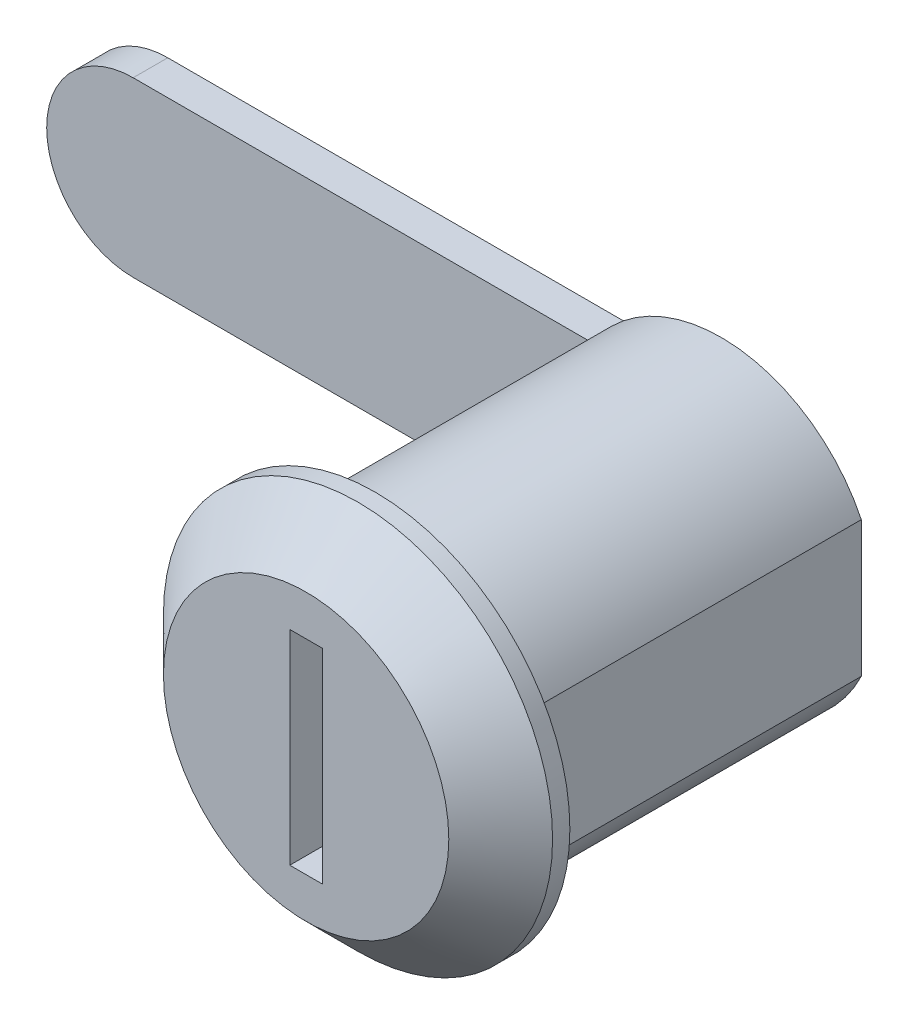
ISO-10303-21;
HEADER;
FILE_DESCRIPTION(('STEP AP214'),'2;1');
FILE_NAME('part.step','',(''),(''),'','','');
FILE_SCHEMA(('AUTOMOTIVE_DESIGN { 1 0 10303 214 1 1 1 1 }'));
ENDSEC;
DATA;
#1=APPLICATION_CONTEXT('core data for automotive mechanical design processes');
#2=APPLICATION_PROTOCOL_DEFINITION('international standard','automotive_design',2000,#1);
#3=PRODUCT_CONTEXT('',#1,'mechanical');
#4=PRODUCT('Part','Part','',(#3));
#5=PRODUCT_RELATED_PRODUCT_CATEGORY('part','',(#4));
#6=PRODUCT_DEFINITION_FORMATION('','',#4);
#7=PRODUCT_DEFINITION_CONTEXT('part definition',#1,'design');
#8=PRODUCT_DEFINITION('design','',#6,#7);
#9=PRODUCT_DEFINITION_SHAPE('','',#8);
#10=(LENGTH_UNIT() NAMED_UNIT(*) SI_UNIT(.MILLI.,.METRE.));
#11=(NAMED_UNIT(*) PLANE_ANGLE_UNIT() SI_UNIT($,.RADIAN.));
#12=(NAMED_UNIT(*) SI_UNIT($,.STERADIAN.) SOLID_ANGLE_UNIT());
#13=UNCERTAINTY_MEASURE_WITH_UNIT(LENGTH_MEASURE(1.E-05),#10,'distance_accuracy_value','');
#14=(GEOMETRIC_REPRESENTATION_CONTEXT(3) GLOBAL_UNCERTAINTY_ASSIGNED_CONTEXT((#13)) GLOBAL_UNIT_ASSIGNED_CONTEXT((#10,
#11,#12)) REPRESENTATION_CONTEXT('',''));
#15=CARTESIAN_POINT('',(0.,0.,0.));
#16=DIRECTION('',(0.,0.,1.));
#17=DIRECTION('',(1.,0.,0.));
#18=AXIS2_PLACEMENT_3D('',#15,#16,#17);
#19=CARTESIAN_POINT('',(0.,0.,0.));
#20=DIRECTION('',(0.,0.,1.));
#21=DIRECTION('',(1.,0.,0.));
#22=AXIS2_PLACEMENT_3D('',#19,#20,#21);
#23=PLANE('',#22);
#24=CARTESIAN_POINT('',(0.,0.,0.));
#25=DIRECTION('',(0.,0.,1.));
#26=DIRECTION('',(1.,0.,0.));
#27=AXIS2_PLACEMENT_3D('',#24,#25,#26);
#28=CIRCLE('',#27,11.25);
#29=CARTESIAN_POINT('',(11.25,0.,0.));
#30=VERTEX_POINT('',#29);
#31=EDGE_CURVE('E223',#30,#30,#28,.T.);
#32=ORIENTED_EDGE('',*,*,#31,.F.);
#33=EDGE_LOOP('',(#32));
#34=FACE_BOUND('',#33,.T.);
#35=CARTESIAN_POINT('',(0.,0.,0.));
#36=DIRECTION('',(0.,0.,-1.));
#37=DIRECTION('',(-1.,0.,0.));
#38=AXIS2_PLACEMENT_3D('',#35,#36,#37);
#39=CIRCLE('',#38,9.);
#40=CARTESIAN_POINT('',(8.1,-3.92300904918661,0.));
#41=VERTEX_POINT('',#40);
#42=CARTESIAN_POINT('',(-8.1,-3.92300904918661,0.));
#43=VERTEX_POINT('',#42);
#44=EDGE_CURVE('E156',#41,#43,#39,.T.);
#45=ORIENTED_EDGE('',*,*,#44,.F.);
#46=DIRECTION('',(0.,-1.,0.));
#47=VECTOR('',#46,1.);
#48=CARTESIAN_POINT('',(8.1,-3.92300904918661,0.));
#49=LINE('',#48,#47);
#50=CARTESIAN_POINT('',(8.1,3.92300904918661,0.));
#51=VERTEX_POINT('',#50);
#52=EDGE_CURVE('E183',#51,#41,#49,.T.);
#53=ORIENTED_EDGE('',*,*,#52,.F.);
#54=CARTESIAN_POINT('',(0.,0.,0.));
#55=DIRECTION('',(0.,0.,-1.));
#56=DIRECTION('',(-1.,0.,0.));
#57=AXIS2_PLACEMENT_3D('',#54,#55,#56);
#58=CIRCLE('',#57,9.);
#59=CARTESIAN_POINT('',(-8.1,3.92300904918661,0.));
#60=VERTEX_POINT('',#59);
#61=EDGE_CURVE('E180',#60,#51,#58,.T.);
#62=ORIENTED_EDGE('',*,*,#61,.F.);
#63=DIRECTION('',(0.,1.,0.));
#64=VECTOR('',#63,1.);
#65=CARTESIAN_POINT('',(-8.1,-3.92300904918661,0.));
#66=LINE('',#65,#64);
#67=EDGE_CURVE('E159',#43,#60,#66,.T.);
#68=ORIENTED_EDGE('',*,*,#67,.F.);
#69=EDGE_LOOP('',(#45,#53,#62,#68));
#70=FACE_BOUND('',#69,.T.);
#71=ADVANCED_FACE('F40',(#34,#70),#23,.F.);
#72=CARTESIAN_POINT('',(0.,0.,4.));
#73=DIRECTION('',(0.,0.,-1.));
#74=DIRECTION('',(-1.,0.,0.));
#75=AXIS2_PLACEMENT_3D('',#72,#73,#74);
#76=CYLINDRICAL_SURFACE('',#75,11.25);
#77=CARTESIAN_POINT('',(0.,0.,0.999999999999982));
#78=DIRECTION('',(0.,0.,1.));
#79=DIRECTION('',(1.,0.,0.));
#80=AXIS2_PLACEMENT_3D('',#77,#78,#79);
#81=CIRCLE('',#80,11.25);
#82=CARTESIAN_POINT('',(11.25,0.,0.999999999999982));
#83=VERTEX_POINT('',#82);
#84=EDGE_CURVE('E11',#83,#83,#81,.F.);
#85=ORIENTED_EDGE('',*,*,#84,.T.);
#86=EDGE_LOOP('',(#85));
#87=FACE_BOUND('',#86,.T.);
#88=ORIENTED_EDGE('',*,*,#31,.T.);
#89=EDGE_LOOP('',(#88));
#90=FACE_BOUND('',#89,.T.);
#91=ADVANCED_FACE('F264',(#87,#90),#76,.T.);
#92=CARTESIAN_POINT('',(0.,0.,4.));
#93=DIRECTION('',(0.,0.,1.));
#94=DIRECTION('',(1.,0.,0.));
#95=AXIS2_PLACEMENT_3D('',#92,#93,#94);
#96=PLANE('',#95);
#97=CARTESIAN_POINT('',(0.,0.,4.));
#98=DIRECTION('',(0.,0.,1.));
#99=DIRECTION('',(1.,0.,0.));
#100=AXIS2_PLACEMENT_3D('',#97,#98,#99);
#101=CIRCLE('',#100,8.24999999999999);
#102=CARTESIAN_POINT('',(8.24999999999999,0.,4.));
#103=VERTEX_POINT('',#102);
#104=EDGE_CURVE('E49',#103,#103,#101,.T.);
#105=ORIENTED_EDGE('',*,*,#104,.T.);
#106=EDGE_LOOP('',(#105));
#107=FACE_BOUND('',#106,.T.);
#108=DIRECTION('',(0.,1.,0.));
#109=VECTOR('',#108,1.);
#110=CARTESIAN_POINT('',(0.945004589681275,-5.90323373364755,4.));
#111=LINE('',#110,#109);
#112=CARTESIAN_POINT('',(0.945004589681275,-5.90323373364755,4.));
#113=VERTEX_POINT('',#112);
#114=CARTESIAN_POINT('',(0.945004589681275,5.90323373364754,4.));
#115=VERTEX_POINT('',#114);
#116=EDGE_CURVE('E197',#113,#115,#111,.T.);
#117=ORIENTED_EDGE('',*,*,#116,.F.);
#118=DIRECTION('',(1.,0.,0.));
#119=VECTOR('',#118,1.);
#120=CARTESIAN_POINT('',(-0.945004589681277,-5.90323373364755,4.));
#121=LINE('',#120,#119);
#122=CARTESIAN_POINT('',(-0.945004589681277,-5.90323373364755,4.));
#123=VERTEX_POINT('',#122);
#124=EDGE_CURVE('E202',#123,#113,#121,.T.);
#125=ORIENTED_EDGE('',*,*,#124,.F.);
#126=DIRECTION('',(0.,-1.,0.));
#127=VECTOR('',#126,1.);
#128=CARTESIAN_POINT('',(-0.945004589681277,-5.90323373364755,4.));
#129=LINE('',#128,#127);
#130=CARTESIAN_POINT('',(-0.945004589681277,5.90323373364754,4.));
#131=VERTEX_POINT('',#130);
#132=EDGE_CURVE('E216',#131,#123,#129,.T.);
#133=ORIENTED_EDGE('',*,*,#132,.F.);
#134=DIRECTION('',(-1.,0.,0.));
#135=VECTOR('',#134,1.);
#136=CARTESIAN_POINT('',(-0.945004589681277,5.90323373364754,4.));
#137=LINE('',#136,#135);
#138=EDGE_CURVE('E213',#115,#131,#137,.T.);
#139=ORIENTED_EDGE('',*,*,#138,.F.);
#140=EDGE_LOOP('',(#117,#125,#133,#139));
#141=FACE_BOUND('',#140,.T.);
#142=ADVANCED_FACE('F270',(#107,#141),#96,.T.);
#143=CARTESIAN_POINT('',(0.945004589681275,-5.90323373364755,2.));
#144=DIRECTION('',(1.,0.,0.));
#145=DIRECTION('',(0.,0.,-1.));
#146=AXIS2_PLACEMENT_3D('',#143,#144,#145);
#147=PLANE('',#146);
#148=ORIENTED_EDGE('',*,*,#116,.T.);
#149=DIRECTION('',(0.,0.,1.));
#150=VECTOR('',#149,1.);
#151=CARTESIAN_POINT('',(0.945004589681275,5.90323373364754,2.));
#152=LINE('',#151,#150);
#153=CARTESIAN_POINT('',(0.945004589681275,5.90323373364754,2.));
#154=VERTEX_POINT('',#153);
#155=EDGE_CURVE('E211',#154,#115,#152,.T.);
#156=ORIENTED_EDGE('',*,*,#155,.F.);
#157=DIRECTION('',(0.,1.,0.));
#158=VECTOR('',#157,1.);
#159=CARTESIAN_POINT('',(0.945004589681275,-5.90323373364755,2.));
#160=LINE('',#159,#158);
#161=CARTESIAN_POINT('',(0.945004589681275,-5.90323373364755,2.));
#162=VERTEX_POINT('',#161);
#163=EDGE_CURVE('E198',#162,#154,#160,.T.);
#164=ORIENTED_EDGE('',*,*,#163,.F.);
#165=DIRECTION('',(0.,0.,1.));
#166=VECTOR('',#165,1.);
#167=CARTESIAN_POINT('',(0.945004589681275,-5.90323373364755,2.));
#168=LINE('',#167,#166);
#169=EDGE_CURVE('E221',#162,#113,#168,.T.);
#170=ORIENTED_EDGE('',*,*,#169,.T.);
#171=EDGE_LOOP('',(#148,#156,#164,#170));
#172=FACE_BOUND('',#171,.T.);
#173=ADVANCED_FACE('F277',(#172),#147,.F.);
#174=CARTESIAN_POINT('',(-0.945004589681277,-5.90323373364755,2.));
#175=DIRECTION('',(0.,-1.,0.));
#176=DIRECTION('',(0.,0.,-1.));
#177=AXIS2_PLACEMENT_3D('',#174,#175,#176);
#178=PLANE('',#177);
#179=ORIENTED_EDGE('',*,*,#124,.T.);
#180=ORIENTED_EDGE('',*,*,#169,.F.);
#181=DIRECTION('',(1.,0.,0.));
#182=VECTOR('',#181,1.);
#183=CARTESIAN_POINT('',(-0.945004589681277,-5.90323373364755,2.));
#184=LINE('',#183,#182);
#185=CARTESIAN_POINT('',(-0.945004589681277,-5.90323373364755,2.));
#186=VERTEX_POINT('',#185);
#187=EDGE_CURVE('E208',#186,#162,#184,.T.);
#188=ORIENTED_EDGE('',*,*,#187,.F.);
#189=DIRECTION('',(0.,0.,1.));
#190=VECTOR('',#189,1.);
#191=CARTESIAN_POINT('',(-0.945004589681277,-5.90323373364755,2.));
#192=LINE('',#191,#190);
#193=EDGE_CURVE('E224',#186,#123,#192,.T.);
#194=ORIENTED_EDGE('',*,*,#193,.T.);
#195=EDGE_LOOP('',(#179,#180,#188,#194));
#196=FACE_BOUND('',#195,.T.);
#197=ADVANCED_FACE('F280',(#196),#178,.F.);
#198=CARTESIAN_POINT('',(-0.945004589681277,-5.90323373364755,2.));
#199=DIRECTION('',(-1.,0.,0.));
#200=DIRECTION('',(0.,0.,1.));
#201=AXIS2_PLACEMENT_3D('',#198,#199,#200);
#202=PLANE('',#201);
#203=ORIENTED_EDGE('',*,*,#132,.T.);
#204=ORIENTED_EDGE('',*,*,#193,.F.);
#205=DIRECTION('',(0.,-1.,0.));
#206=VECTOR('',#205,1.);
#207=CARTESIAN_POINT('',(-0.945004589681277,-5.90323373364755,2.));
#208=LINE('',#207,#206);
#209=CARTESIAN_POINT('',(-0.945004589681277,5.90323373364754,2.));
#210=VERTEX_POINT('',#209);
#211=EDGE_CURVE('E205',#210,#186,#208,.T.);
#212=ORIENTED_EDGE('',*,*,#211,.F.);
#213=DIRECTION('',(0.,0.,1.));
#214=VECTOR('',#213,1.);
#215=CARTESIAN_POINT('',(-0.945004589681277,5.90323373364754,2.));
#216=LINE('',#215,#214);
#217=EDGE_CURVE('E226',#210,#131,#216,.T.);
#218=ORIENTED_EDGE('',*,*,#217,.T.);
#219=EDGE_LOOP('',(#203,#204,#212,#218));
#220=FACE_BOUND('',#219,.T.);
#221=ADVANCED_FACE('F286',(#220),#202,.F.);
#222=CARTESIAN_POINT('',(-0.945004589681277,5.90323373364754,2.));
#223=DIRECTION('',(0.,1.,0.));
#224=DIRECTION('',(0.,0.,1.));
#225=AXIS2_PLACEMENT_3D('',#222,#223,#224);
#226=PLANE('',#225);
#227=ORIENTED_EDGE('',*,*,#138,.T.);
#228=ORIENTED_EDGE('',*,*,#217,.F.);
#229=DIRECTION('',(-1.,0.,0.));
#230=VECTOR('',#229,1.);
#231=CARTESIAN_POINT('',(-0.945004589681277,5.90323373364754,2.));
#232=LINE('',#231,#230);
#233=EDGE_CURVE('E201',#154,#210,#232,.T.);
#234=ORIENTED_EDGE('',*,*,#233,.F.);
#235=ORIENTED_EDGE('',*,*,#155,.T.);
#236=EDGE_LOOP('',(#227,#228,#234,#235));
#237=FACE_BOUND('',#236,.T.);
#238=ADVANCED_FACE('F282',(#237),#226,.F.);
#239=CARTESIAN_POINT('',(0.,0.,2.));
#240=DIRECTION('',(0.,0.,-1.));
#241=DIRECTION('',(-1.,0.,0.));
#242=AXIS2_PLACEMENT_3D('',#239,#240,#241);
#243=PLANE('',#242);
#244=ORIENTED_EDGE('',*,*,#163,.T.);
#245=ORIENTED_EDGE('',*,*,#233,.T.);
#246=ORIENTED_EDGE('',*,*,#211,.T.);
#247=ORIENTED_EDGE('',*,*,#187,.T.);
#248=EDGE_LOOP('',(#244,#245,#246,#247));
#249=FACE_BOUND('',#248,.T.);
#250=ADVANCED_FACE('F285',(#249),#243,.F.);
#251=CARTESIAN_POINT('',(0.,0.,-20.));
#252=DIRECTION('',(0.,0.,1.));
#253=DIRECTION('',(1.,0.,0.));
#254=AXIS2_PLACEMENT_3D('',#251,#252,#253);
#255=CYLINDRICAL_SURFACE('',#254,9.);
#256=ORIENTED_EDGE('',*,*,#44,.T.);
#257=DIRECTION('',(0.,0.,1.));
#258=VECTOR('',#257,1.);
#259=CARTESIAN_POINT('',(-8.1,-3.92300904918661,-20.));
#260=LINE('',#259,#258);
#261=CARTESIAN_POINT('',(-8.1,-3.92300904918661,-20.));
#262=VERTEX_POINT('',#261);
#263=EDGE_CURVE('E194',#262,#43,#260,.T.);
#264=ORIENTED_EDGE('',*,*,#263,.F.);
#265=CARTESIAN_POINT('',(0.,0.,-20.));
#266=DIRECTION('',(0.,0.,-1.));
#267=DIRECTION('',(-1.,0.,0.));
#268=AXIS2_PLACEMENT_3D('',#265,#266,#267);
#269=CIRCLE('',#268,9.);
#270=CARTESIAN_POINT('',(-7.48331477354788,-5.,-20.));
#271=VERTEX_POINT('',#270);
#272=EDGE_CURVE('E168',#271,#262,#269,.T.);
#273=ORIENTED_EDGE('',*,*,#272,.F.);
#274=CARTESIAN_POINT('',(8.1,-3.92300904918661,-20.));
#275=VERTEX_POINT('',#274);
#276=EDGE_CURVE('E165',#275,#271,#269,.T.);
#277=ORIENTED_EDGE('',*,*,#276,.F.);
#278=DIRECTION('',(0.,0.,1.));
#279=VECTOR('',#278,1.);
#280=CARTESIAN_POINT('',(8.1,-3.92300904918661,-20.));
#281=LINE('',#280,#279);
#282=EDGE_CURVE('E176',#275,#41,#281,.T.);
#283=ORIENTED_EDGE('',*,*,#282,.T.);
#284=EDGE_LOOP('',(#256,#264,#273,#277,#283));
#285=FACE_BOUND('',#284,.T.);
#286=ADVANCED_FACE('F296',(#285),#255,.T.);
#287=CARTESIAN_POINT('',(-8.1,-3.92300904918661,-20.));
#288=DIRECTION('',(1.,0.,0.));
#289=DIRECTION('',(0.,0.,-1.));
#290=AXIS2_PLACEMENT_3D('',#287,#288,#289);
#291=PLANE('',#290);
#292=ORIENTED_EDGE('',*,*,#67,.T.);
#293=DIRECTION('',(0.,0.,1.));
#294=VECTOR('',#293,1.);
#295=CARTESIAN_POINT('',(-8.1,3.92300904918661,-20.));
#296=LINE('',#295,#294);
#297=CARTESIAN_POINT('',(-8.1,3.92300904918661,-20.));
#298=VERTEX_POINT('',#297);
#299=EDGE_CURVE('E191',#298,#60,#296,.T.);
#300=ORIENTED_EDGE('',*,*,#299,.F.);
#301=DIRECTION('',(0.,1.,0.));
#302=VECTOR('',#301,1.);
#303=CARTESIAN_POINT('',(-8.1,-3.92300904918661,-20.));
#304=LINE('',#303,#302);
#305=EDGE_CURVE('E167',#262,#298,#304,.T.);
#306=ORIENTED_EDGE('',*,*,#305,.F.);
#307=ORIENTED_EDGE('',*,*,#263,.T.);
#308=EDGE_LOOP('',(#292,#300,#306,#307));
#309=FACE_BOUND('',#308,.T.);
#310=ADVANCED_FACE('F300',(#309),#291,.F.);
#311=CARTESIAN_POINT('',(0.,0.,-20.));
#312=DIRECTION('',(0.,0.,1.));
#313=DIRECTION('',(1.,0.,0.));
#314=AXIS2_PLACEMENT_3D('',#311,#312,#313);
#315=CYLINDRICAL_SURFACE('',#314,9.);
#316=ORIENTED_EDGE('',*,*,#61,.T.);
#317=DIRECTION('',(0.,0.,1.));
#318=VECTOR('',#317,1.);
#319=CARTESIAN_POINT('',(8.1,3.92300904918661,-20.));
#320=LINE('',#319,#318);
#321=CARTESIAN_POINT('',(8.1,3.92300904918661,-20.));
#322=VERTEX_POINT('',#321);
#323=EDGE_CURVE('E188',#322,#51,#320,.T.);
#324=ORIENTED_EDGE('',*,*,#323,.F.);
#325=CARTESIAN_POINT('',(0.,0.,-20.));
#326=DIRECTION('',(0.,0.,-1.));
#327=DIRECTION('',(-1.,0.,0.));
#328=AXIS2_PLACEMENT_3D('',#325,#326,#327);
#329=CIRCLE('',#328,9.);
#330=CARTESIAN_POINT('',(-7.48331477354788,5.,-20.));
#331=VERTEX_POINT('',#330);
#332=EDGE_CURVE('E171',#331,#322,#329,.T.);
#333=ORIENTED_EDGE('',*,*,#332,.F.);
#334=EDGE_CURVE('E172',#298,#331,#329,.T.);
#335=ORIENTED_EDGE('',*,*,#334,.F.);
#336=ORIENTED_EDGE('',*,*,#299,.T.);
#337=EDGE_LOOP('',(#316,#324,#333,#335,#336));
#338=FACE_BOUND('',#337,.T.);
#339=ADVANCED_FACE('F304',(#338),#315,.T.);
#340=CARTESIAN_POINT('',(8.1,-3.92300904918661,-20.));
#341=DIRECTION('',(-1.,0.,0.));
#342=DIRECTION('',(0.,0.,1.));
#343=AXIS2_PLACEMENT_3D('',#340,#341,#342);
#344=PLANE('',#343);
#345=ORIENTED_EDGE('',*,*,#52,.T.);
#346=ORIENTED_EDGE('',*,*,#282,.F.);
#347=DIRECTION('',(0.,-1.,0.));
#348=VECTOR('',#347,1.);
#349=CARTESIAN_POINT('',(8.1,-3.92300904918661,-20.));
#350=LINE('',#349,#348);
#351=EDGE_CURVE('E175',#322,#275,#350,.T.);
#352=ORIENTED_EDGE('',*,*,#351,.F.);
#353=ORIENTED_EDGE('',*,*,#323,.T.);
#354=EDGE_LOOP('',(#345,#346,#352,#353));
#355=FACE_BOUND('',#354,.T.);
#356=ADVANCED_FACE('F308',(#355),#344,.F.);
#357=CARTESIAN_POINT('',(0.,0.,-20.));
#358=DIRECTION('',(0.,0.,-1.));
#359=DIRECTION('',(-1.,0.,0.));
#360=AXIS2_PLACEMENT_3D('',#357,#358,#359);
#361=PLANE('',#360);
#362=DIRECTION('',(1.,0.,0.));
#363=VECTOR('',#362,1.);
#364=CARTESIAN_POINT('',(0.,5.,-20.));
#365=LINE('',#364,#363);
#366=CARTESIAN_POINT('',(0.,5.,-20.));
#367=VERTEX_POINT('',#366);
#368=EDGE_CURVE('E231',#331,#367,#365,.T.);
#369=ORIENTED_EDGE('',*,*,#368,.F.);
#370=ORIENTED_EDGE('',*,*,#332,.T.);
#371=ORIENTED_EDGE('',*,*,#351,.T.);
#372=ORIENTED_EDGE('',*,*,#276,.T.);
#373=DIRECTION('',(-1.,0.,0.));
#374=VECTOR('',#373,1.);
#375=CARTESIAN_POINT('',(0.,-5.,-20.));
#376=LINE('',#375,#374);
#377=CARTESIAN_POINT('',(0.,-5.,-20.));
#378=VERTEX_POINT('',#377);
#379=EDGE_CURVE('E61',#378,#271,#376,.T.);
#380=ORIENTED_EDGE('',*,*,#379,.F.);
#381=CARTESIAN_POINT('',(0.,0.,-20.));
#382=DIRECTION('',(0.,0.,-1.));
#383=DIRECTION('',(-1.,0.,0.));
#384=AXIS2_PLACEMENT_3D('',#381,#382,#383);
#385=CIRCLE('',#384,5.);
#386=EDGE_CURVE('E56',#367,#378,#385,.T.);
#387=ORIENTED_EDGE('',*,*,#386,.F.);
#388=EDGE_LOOP('',(#369,#370,#371,#372,#380,#387));
#389=FACE_BOUND('',#388,.T.);
#390=ADVANCED_FACE('F312',(#389),#361,.T.);
#391=CARTESIAN_POINT('',(0.,0.,-20.));
#392=DIRECTION('',(0.,0.,-1.));
#393=DIRECTION('',(-1.,0.,0.));
#394=AXIS2_PLACEMENT_3D('',#391,#392,#393);
#395=PLANE('',#394);
#396=CARTESIAN_POINT('',(-34.,-5.,-20.));
#397=VERTEX_POINT('',#396);
#398=EDGE_CURVE('E246',#271,#397,#376,.T.);
#399=ORIENTED_EDGE('',*,*,#398,.F.);
#400=ORIENTED_EDGE('',*,*,#272,.T.);
#401=ORIENTED_EDGE('',*,*,#305,.T.);
#402=ORIENTED_EDGE('',*,*,#334,.T.);
#403=CARTESIAN_POINT('',(-34.,5.,-20.));
#404=VERTEX_POINT('',#403);
#405=EDGE_CURVE('E153',#404,#331,#365,.T.);
#406=ORIENTED_EDGE('',*,*,#405,.F.);
#407=CARTESIAN_POINT('',(-34.,0.,-20.));
#408=DIRECTION('',(0.,0.,-1.));
#409=DIRECTION('',(-1.,0.,0.));
#410=AXIS2_PLACEMENT_3D('',#407,#408,#409);
#411=CIRCLE('',#410,5.);
#412=EDGE_CURVE('E240',#397,#404,#411,.T.);
#413=ORIENTED_EDGE('',*,*,#412,.F.);
#414=EDGE_LOOP('',(#399,#400,#401,#402,#406,#413));
#415=FACE_BOUND('',#414,.T.);
#416=ADVANCED_FACE('F316',(#415),#395,.F.);
#417=CARTESIAN_POINT('',(0.,0.,-22.));
#418=DIRECTION('',(0.,0.,1.));
#419=DIRECTION('',(1.,0.,0.));
#420=AXIS2_PLACEMENT_3D('',#417,#418,#419);
#421=CYLINDRICAL_SURFACE('',#420,5.);
#422=ORIENTED_EDGE('',*,*,#386,.T.);
#423=DIRECTION('',(0.,0.,1.));
#424=VECTOR('',#423,1.);
#425=CARTESIAN_POINT('',(0.,-5.,-22.));
#426=LINE('',#425,#424);
#427=CARTESIAN_POINT('',(0.,-5.,-22.));
#428=VERTEX_POINT('',#427);
#429=EDGE_CURVE('E138',#428,#378,#426,.T.);
#430=ORIENTED_EDGE('',*,*,#429,.F.);
#431=CARTESIAN_POINT('',(0.,0.,-22.));
#432=DIRECTION('',(0.,0.,-1.));
#433=DIRECTION('',(-1.,0.,0.));
#434=AXIS2_PLACEMENT_3D('',#431,#432,#433);
#435=CIRCLE('',#434,5.);
#436=CARTESIAN_POINT('',(0.,5.,-22.));
#437=VERTEX_POINT('',#436);
#438=EDGE_CURVE('E144',#437,#428,#435,.T.);
#439=ORIENTED_EDGE('',*,*,#438,.F.);
#440=DIRECTION('',(0.,0.,1.));
#441=VECTOR('',#440,1.);
#442=CARTESIAN_POINT('',(0.,5.,-22.));
#443=LINE('',#442,#441);
#444=EDGE_CURVE('E251',#437,#367,#443,.T.);
#445=ORIENTED_EDGE('',*,*,#444,.T.);
#446=EDGE_LOOP('',(#422,#430,#439,#445));
#447=FACE_BOUND('',#446,.T.);
#448=ADVANCED_FACE('F155',(#447),#421,.T.);
#449=CARTESIAN_POINT('',(0.,-5.,-22.));
#450=DIRECTION('',(0.,1.,0.));
#451=DIRECTION('',(0.,0.,1.));
#452=AXIS2_PLACEMENT_3D('',#449,#450,#451);
#453=PLANE('',#452);
#454=ORIENTED_EDGE('',*,*,#379,.T.);
#455=ORIENTED_EDGE('',*,*,#398,.T.);
#456=DIRECTION('',(0.,0.,1.));
#457=VECTOR('',#456,1.);
#458=CARTESIAN_POINT('',(-34.,-5.,-22.));
#459=LINE('',#458,#457);
#460=CARTESIAN_POINT('',(-34.,-5.,-22.));
#461=VERTEX_POINT('',#460);
#462=EDGE_CURVE('E140',#461,#397,#459,.T.);
#463=ORIENTED_EDGE('',*,*,#462,.F.);
#464=DIRECTION('',(-1.,0.,0.));
#465=VECTOR('',#464,1.);
#466=CARTESIAN_POINT('',(0.,-5.,-22.));
#467=LINE('',#466,#465);
#468=EDGE_CURVE('E134',#428,#461,#467,.T.);
#469=ORIENTED_EDGE('',*,*,#468,.F.);
#470=ORIENTED_EDGE('',*,*,#429,.T.);
#471=EDGE_LOOP('',(#454,#455,#463,#469,#470));
#472=FACE_BOUND('',#471,.T.);
#473=ADVANCED_FACE('F136',(#472),#453,.F.);
#474=CARTESIAN_POINT('',(-34.,0.,-22.));
#475=DIRECTION('',(0.,0.,1.));
#476=DIRECTION('',(1.,0.,0.));
#477=AXIS2_PLACEMENT_3D('',#474,#475,#476);
#478=CYLINDRICAL_SURFACE('',#477,5.);
#479=ORIENTED_EDGE('',*,*,#412,.T.);
#480=DIRECTION('',(0.,0.,1.));
#481=VECTOR('',#480,1.);
#482=CARTESIAN_POINT('',(-34.,5.,-22.));
#483=LINE('',#482,#481);
#484=CARTESIAN_POINT('',(-34.,5.,-22.));
#485=VERTEX_POINT('',#484);
#486=EDGE_CURVE('E161',#485,#404,#483,.T.);
#487=ORIENTED_EDGE('',*,*,#486,.F.);
#488=CARTESIAN_POINT('',(-34.,0.,-22.));
#489=DIRECTION('',(0.,0.,-1.));
#490=DIRECTION('',(-1.,0.,0.));
#491=AXIS2_PLACEMENT_3D('',#488,#489,#490);
#492=CIRCLE('',#491,5.);
#493=EDGE_CURVE('E143',#461,#485,#492,.T.);
#494=ORIENTED_EDGE('',*,*,#493,.F.);
#495=ORIENTED_EDGE('',*,*,#462,.T.);
#496=EDGE_LOOP('',(#479,#487,#494,#495));
#497=FACE_BOUND('',#496,.T.);
#498=ADVANCED_FACE('F252',(#497),#478,.T.);
#499=CARTESIAN_POINT('',(0.,5.,-22.));
#500=DIRECTION('',(0.,-1.,0.));
#501=DIRECTION('',(0.,0.,-1.));
#502=AXIS2_PLACEMENT_3D('',#499,#500,#501);
#503=PLANE('',#502);
#504=ORIENTED_EDGE('',*,*,#405,.T.);
#505=ORIENTED_EDGE('',*,*,#368,.T.);
#506=ORIENTED_EDGE('',*,*,#444,.F.);
#507=DIRECTION('',(1.,0.,0.));
#508=VECTOR('',#507,1.);
#509=CARTESIAN_POINT('',(0.,5.,-22.));
#510=LINE('',#509,#508);
#511=EDGE_CURVE('E149',#485,#437,#510,.T.);
#512=ORIENTED_EDGE('',*,*,#511,.F.);
#513=ORIENTED_EDGE('',*,*,#486,.T.);
#514=EDGE_LOOP('',(#504,#505,#506,#512,#513));
#515=FACE_BOUND('',#514,.T.);
#516=ADVANCED_FACE('F253',(#515),#503,.F.);
#517=CARTESIAN_POINT('',(0.,0.,-22.));
#518=DIRECTION('',(0.,0.,-1.));
#519=DIRECTION('',(-1.,0.,0.));
#520=AXIS2_PLACEMENT_3D('',#517,#518,#519);
#521=PLANE('',#520);
#522=ORIENTED_EDGE('',*,*,#438,.T.);
#523=ORIENTED_EDGE('',*,*,#468,.T.);
#524=ORIENTED_EDGE('',*,*,#493,.T.);
#525=ORIENTED_EDGE('',*,*,#511,.T.);
#526=EDGE_LOOP('',(#522,#523,#524,#525));
#527=FACE_BOUND('',#526,.T.);
#528=ADVANCED_FACE('F147',(#527),#521,.T.);
#529=CARTESIAN_POINT('',(0.,0.,4.));
#530=DIRECTION('',(0.,0.,-1.));
#531=DIRECTION('',(-1.,0.,0.));
#532=AXIS2_PLACEMENT_3D('',#529,#530,#531);
#533=CONICAL_SURFACE('',#532,8.24999999999999,0.785398163397446);
#534=ORIENTED_EDGE('',*,*,#84,.F.);
#535=EDGE_LOOP('',(#534));
#536=FACE_BOUND('',#535,.T.);
#537=ORIENTED_EDGE('',*,*,#104,.F.);
#538=EDGE_LOOP('',(#537));
#539=FACE_BOUND('',#538,.T.);
#540=ADVANCED_FACE('F43',(#536,#539),#533,.T.);
#541=CLOSED_SHELL('',(#71,#91,#142,#173,#197,#221,#238,#250,#286,#310,#339,#356,#390,#416,#448,
#473,#498,#516,#528,#540));
#542=MANIFOLD_SOLID_BREP('B2',#541);
#543=ADVANCED_BREP_SHAPE_REPRESENTATION('',(#18,#542),#14);
#544=SHAPE_DEFINITION_REPRESENTATION(#9,#543);
ENDSEC;
END-ISO-10303-21;
